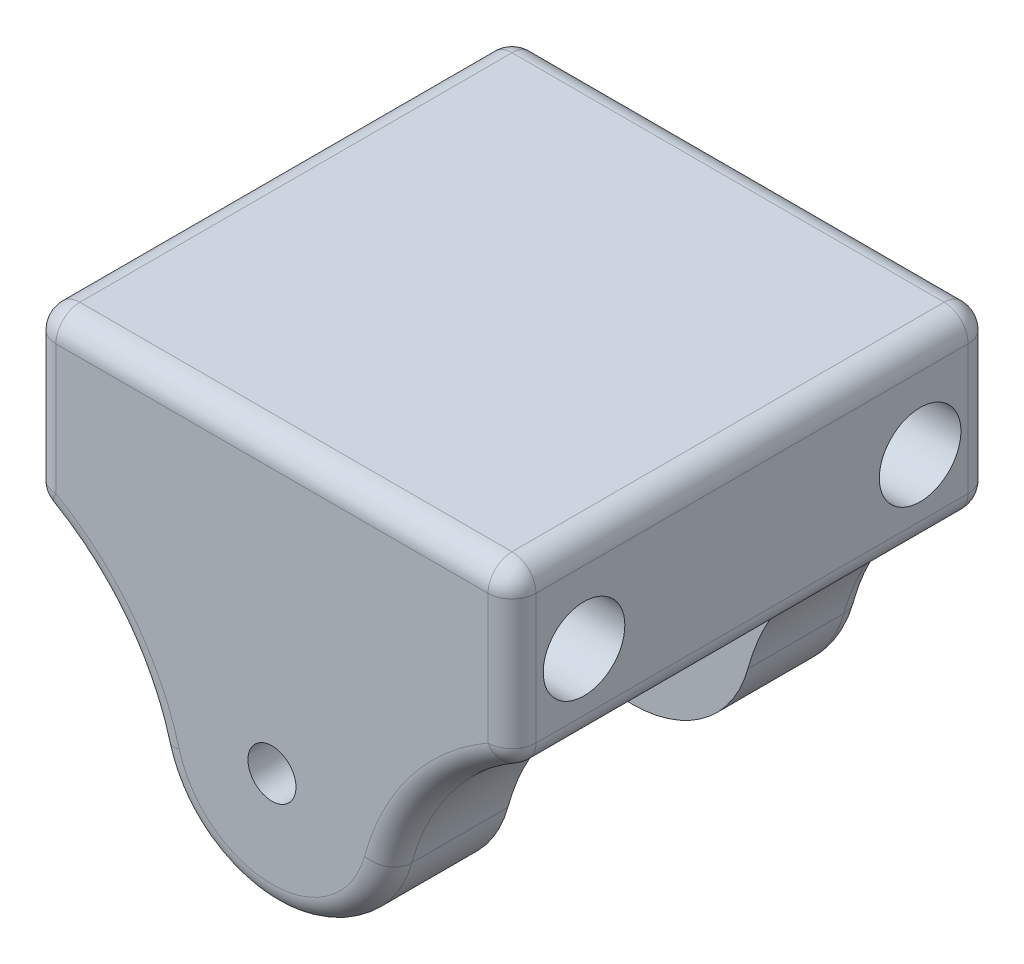
ISO-10303-21;
HEADER;
FILE_DESCRIPTION(('STEP AP214'),'2;1');
FILE_NAME('part.step','',(''),(''),'','','');
FILE_SCHEMA(('AUTOMOTIVE_DESIGN { 1 0 10303 214 1 1 1 1 }'));
ENDSEC;
DATA;
#1=APPLICATION_CONTEXT('core data for automotive mechanical design processes');
#2=APPLICATION_PROTOCOL_DEFINITION('international standard','automotive_design',2000,#1);
#3=PRODUCT_CONTEXT('',#1,'mechanical');
#4=PRODUCT('Part','Part','',(#3));
#5=PRODUCT_RELATED_PRODUCT_CATEGORY('part','',(#4));
#6=PRODUCT_DEFINITION_FORMATION('','',#4);
#7=PRODUCT_DEFINITION_CONTEXT('part definition',#1,'design');
#8=PRODUCT_DEFINITION('design','',#6,#7);
#9=PRODUCT_DEFINITION_SHAPE('','',#8);
#10=(LENGTH_UNIT() NAMED_UNIT(*) SI_UNIT(.MILLI.,.METRE.));
#11=(NAMED_UNIT(*) PLANE_ANGLE_UNIT() SI_UNIT($,.RADIAN.));
#12=(NAMED_UNIT(*) SI_UNIT($,.STERADIAN.) SOLID_ANGLE_UNIT());
#13=UNCERTAINTY_MEASURE_WITH_UNIT(LENGTH_MEASURE(1.E-05),#10,'distance_accuracy_value','');
#14=(GEOMETRIC_REPRESENTATION_CONTEXT(3) GLOBAL_UNCERTAINTY_ASSIGNED_CONTEXT((#13)) GLOBAL_UNIT_ASSIGNED_CONTEXT((#10,
#11,#12)) REPRESENTATION_CONTEXT('',''));
#15=CARTESIAN_POINT('',(0.,0.,0.));
#16=DIRECTION('',(0.,0.,1.));
#17=DIRECTION('',(1.,0.,0.));
#18=AXIS2_PLACEMENT_3D('',#15,#16,#17);
#19=CARTESIAN_POINT('',(0.,0.,20.));
#20=DIRECTION('',(0.,0.,-1.));
#21=DIRECTION('',(-1.,0.,0.));
#22=AXIS2_PLACEMENT_3D('',#19,#20,#21);
#23=CYLINDRICAL_SURFACE('',#22,5.);
#24=DIRECTION('',(0.,0.,-1.));
#25=VECTOR('',#24,1.);
#26=CARTESIAN_POINT('',(4.82404531833319,-1.31475730333305,17.5));
#27=LINE('',#26,#25);
#28=CARTESIAN_POINT('',(4.8240464545791,-1.31475313426621,15.));
#29=VERTEX_POINT('',#28);
#30=CARTESIAN_POINT('',(4.82404531833319,-1.31475730333305,19.));
#31=VERTEX_POINT('',#30);
#32=EDGE_CURVE('E205',#29,#31,#27,.F.);
#33=ORIENTED_EDGE('',*,*,#32,.T.);
#34=CARTESIAN_POINT('',(0.,0.,19.));
#35=DIRECTION('',(0.,0.,1.));
#36=DIRECTION('',(1.,0.,0.));
#37=AXIS2_PLACEMENT_3D('',#34,#35,#36);
#38=CIRCLE('',#37,5.);
#39=CARTESIAN_POINT('',(-4.82404531833319,-1.31475730333306,19.));
#40=VERTEX_POINT('',#39);
#41=EDGE_CURVE('E255',#31,#40,#38,.F.);
#42=ORIENTED_EDGE('',*,*,#41,.T.);
#43=DIRECTION('',(0.,0.,-1.));
#44=VECTOR('',#43,1.);
#45=CARTESIAN_POINT('',(-4.82404531833319,-1.31475730333306,20.));
#46=LINE('',#45,#44);
#47=CARTESIAN_POINT('',(-4.82404531833319,-1.31475730333305,15.));
#48=VERTEX_POINT('',#47);
#49=EDGE_CURVE('E188',#40,#48,#46,.T.);
#50=ORIENTED_EDGE('',*,*,#49,.T.);
#51=CARTESIAN_POINT('',(0.,0.,15.));
#52=DIRECTION('',(0.,0.,1.));
#53=DIRECTION('',(1.,0.,0.));
#54=AXIS2_PLACEMENT_3D('',#51,#52,#53);
#55=CIRCLE('',#54,5.);
#56=EDGE_CURVE('E375',#48,#29,#55,.T.);
#57=ORIENTED_EDGE('',*,*,#56,.T.);
#58=EDGE_LOOP('',(#33,#42,#50,#57));
#59=FACE_BOUND('',#58,.T.);
#60=ADVANCED_FACE('F41',(#59),#23,.T.);
#61=CARTESIAN_POINT('',(0.,0.,20.));
#62=DIRECTION('',(0.,0.,-1.));
#63=DIRECTION('',(-1.,0.,0.));
#64=AXIS2_PLACEMENT_3D('',#61,#62,#63);
#65=CYLINDRICAL_SURFACE('',#64,1.);
#66=CARTESIAN_POINT('',(0.,0.,15.));
#67=DIRECTION('',(0.,0.,1.));
#68=DIRECTION('',(1.,0.,0.));
#69=AXIS2_PLACEMENT_3D('',#66,#67,#68);
#70=CIRCLE('',#69,1.);
#71=CARTESIAN_POINT('',(1.,0.,15.));
#72=VERTEX_POINT('',#71);
#73=EDGE_CURVE('E198',#72,#72,#70,.T.);
#74=ORIENTED_EDGE('',*,*,#73,.F.);
#75=EDGE_LOOP('',(#74));
#76=FACE_BOUND('',#75,.T.);
#77=CARTESIAN_POINT('',(0.,0.,20.));
#78=DIRECTION('',(0.,0.,1.));
#79=DIRECTION('',(1.,0.,0.));
#80=AXIS2_PLACEMENT_3D('',#77,#78,#79);
#81=CIRCLE('',#80,1.);
#82=CARTESIAN_POINT('',(1.,0.,20.));
#83=VERTEX_POINT('',#82);
#84=EDGE_CURVE('E391',#83,#83,#81,.T.);
#85=ORIENTED_EDGE('',*,*,#84,.T.);
#86=EDGE_LOOP('',(#85));
#87=FACE_BOUND('',#86,.T.);
#88=ADVANCED_FACE('F512',(#76,#87),#65,.F.);
#89=CARTESIAN_POINT('',(0.,0.,20.));
#90=DIRECTION('',(0.,0.,1.));
#91=DIRECTION('',(1.,0.,0.));
#92=AXIS2_PLACEMENT_3D('',#89,#90,#91);
#93=PLANE('',#92);
#94=DIRECTION('',(0.,-1.,0.));
#95=VECTOR('',#94,1.);
#96=CARTESIAN_POINT('',(-9.,5.,20.));
#97=LINE('',#96,#95);
#98=CARTESIAN_POINT('',(-9.,11.,20.));
#99=VERTEX_POINT('',#98);
#100=CARTESIAN_POINT('',(-9.,5.59804060269926,20.));
#101=VERTEX_POINT('',#100);
#102=EDGE_CURVE('E244',#99,#101,#97,.T.);
#103=ORIENTED_EDGE('',*,*,#102,.T.);
#104=CARTESIAN_POINT('',(-14.4721359549996,-3.94427190999916,20.));
#105=DIRECTION('',(0.,0.,1.));
#106=DIRECTION('',(1.,0.,0.));
#107=AXIS2_PLACEMENT_3D('',#104,#105,#106);
#108=CIRCLE('',#107,11.);
#109=CARTESIAN_POINT('',(-3.85923625466655,-1.05180584266644,20.));
#110=VERTEX_POINT('',#109);
#111=EDGE_CURVE('E252',#101,#110,#108,.F.);
#112=ORIENTED_EDGE('',*,*,#111,.T.);
#113=CARTESIAN_POINT('',(0.,0.,20.));
#114=DIRECTION('',(0.,0.,1.));
#115=DIRECTION('',(1.,0.,0.));
#116=AXIS2_PLACEMENT_3D('',#113,#114,#115);
#117=CIRCLE('',#116,4.);
#118=CARTESIAN_POINT('',(3.85923625466655,-1.05180584266644,20.));
#119=VERTEX_POINT('',#118);
#120=EDGE_CURVE('E250',#110,#119,#117,.T.);
#121=ORIENTED_EDGE('',*,*,#120,.T.);
#122=CARTESIAN_POINT('',(14.4721359549996,-3.94427190999916,20.));
#123=DIRECTION('',(0.,0.,1.));
#124=DIRECTION('',(1.,0.,0.));
#125=AXIS2_PLACEMENT_3D('',#122,#123,#124);
#126=CIRCLE('',#125,11.);
#127=CARTESIAN_POINT('',(9.,5.59804060269926,20.));
#128=VERTEX_POINT('',#127);
#129=EDGE_CURVE('E248',#119,#128,#126,.F.);
#130=ORIENTED_EDGE('',*,*,#129,.T.);
#131=DIRECTION('',(0.,1.,0.));
#132=VECTOR('',#131,1.);
#133=CARTESIAN_POINT('',(9.,12.,20.));
#134=LINE('',#133,#132);
#135=CARTESIAN_POINT('',(9.,11.,20.));
#136=VERTEX_POINT('',#135);
#137=EDGE_CURVE('E246',#128,#136,#134,.T.);
#138=ORIENTED_EDGE('',*,*,#137,.T.);
#139=DIRECTION('',(1.,0.,0.));
#140=VECTOR('',#139,1.);
#141=CARTESIAN_POINT('',(-10.,11.,20.));
#142=LINE('',#141,#140);
#143=EDGE_CURVE('E242',#136,#99,#142,.F.);
#144=ORIENTED_EDGE('',*,*,#143,.T.);
#145=EDGE_LOOP('',(#103,#112,#121,#130,#138,#144));
#146=FACE_BOUND('',#145,.T.);
#147=ORIENTED_EDGE('',*,*,#84,.F.);
#148=EDGE_LOOP('',(#147));
#149=FACE_BOUND('',#148,.T.);
#150=ADVANCED_FACE('F519',(#146,#149),#93,.T.);
#151=CARTESIAN_POINT('',(0.,0.,0.));
#152=DIRECTION('',(0.,0.,1.));
#153=DIRECTION('',(1.,0.,0.));
#154=AXIS2_PLACEMENT_3D('',#151,#152,#153);
#155=PLANE('',#154);
#156=CARTESIAN_POINT('',(0.,0.,0.));
#157=DIRECTION('',(0.,0.,1.));
#158=DIRECTION('',(1.,0.,0.));
#159=AXIS2_PLACEMENT_3D('',#156,#157,#158);
#160=CIRCLE('',#159,4.);
#161=CARTESIAN_POINT('',(3.85923625466655,-1.05180584266644,0.));
#162=VERTEX_POINT('',#161);
#163=CARTESIAN_POINT('',(-3.85923625466655,-1.05180584266644,0.));
#164=VERTEX_POINT('',#163);
#165=EDGE_CURVE('E229',#162,#164,#160,.F.);
#166=ORIENTED_EDGE('',*,*,#165,.T.);
#167=CARTESIAN_POINT('',(-14.4721359549996,-3.94427190999916,0.));
#168=DIRECTION('',(0.,0.,1.));
#169=DIRECTION('',(1.,0.,0.));
#170=AXIS2_PLACEMENT_3D('',#167,#168,#169);
#171=CIRCLE('',#170,11.);
#172=CARTESIAN_POINT('',(-9.,5.59804060269926,0.));
#173=VERTEX_POINT('',#172);
#174=EDGE_CURVE('E231',#164,#173,#171,.T.);
#175=ORIENTED_EDGE('',*,*,#174,.T.);
#176=DIRECTION('',(0.,-1.,0.));
#177=VECTOR('',#176,1.);
#178=CARTESIAN_POINT('',(-9.,0.,0.));
#179=LINE('',#178,#177);
#180=CARTESIAN_POINT('',(-9.,11.,0.));
#181=VERTEX_POINT('',#180);
#182=EDGE_CURVE('E223',#173,#181,#179,.F.);
#183=ORIENTED_EDGE('',*,*,#182,.T.);
#184=DIRECTION('',(1.,0.,0.));
#185=VECTOR('',#184,1.);
#186=CARTESIAN_POINT('',(0.,11.,0.));
#187=LINE('',#186,#185);
#188=CARTESIAN_POINT('',(9.,11.,0.));
#189=VERTEX_POINT('',#188);
#190=EDGE_CURVE('E221',#181,#189,#187,.T.);
#191=ORIENTED_EDGE('',*,*,#190,.T.);
#192=DIRECTION('',(0.,1.,0.));
#193=VECTOR('',#192,1.);
#194=CARTESIAN_POINT('',(9.,0.,0.));
#195=LINE('',#194,#193);
#196=CARTESIAN_POINT('',(9.,5.59804060269926,0.));
#197=VERTEX_POINT('',#196);
#198=EDGE_CURVE('E225',#189,#197,#195,.F.);
#199=ORIENTED_EDGE('',*,*,#198,.T.);
#200=CARTESIAN_POINT('',(14.4721359549996,-3.94427190999916,0.));
#201=DIRECTION('',(0.,0.,1.));
#202=DIRECTION('',(1.,0.,0.));
#203=AXIS2_PLACEMENT_3D('',#200,#201,#202);
#204=CIRCLE('',#203,11.);
#205=EDGE_CURVE('E227',#197,#162,#204,.T.);
#206=ORIENTED_EDGE('',*,*,#205,.T.);
#207=EDGE_LOOP('',(#166,#175,#183,#191,#199,#206));
#208=FACE_BOUND('',#207,.T.);
#209=CARTESIAN_POINT('',(0.,0.,0.));
#210=DIRECTION('',(0.,0.,1.));
#211=DIRECTION('',(1.,0.,0.));
#212=AXIS2_PLACEMENT_3D('',#209,#210,#211);
#213=CIRCLE('',#212,1.);
#214=CARTESIAN_POINT('',(1.,0.,0.));
#215=VERTEX_POINT('',#214);
#216=EDGE_CURVE('E382',#215,#215,#213,.T.);
#217=ORIENTED_EDGE('',*,*,#216,.T.);
#218=EDGE_LOOP('',(#217));
#219=FACE_BOUND('',#218,.T.);
#220=ADVANCED_FACE('F448',(#208,#219),#155,.F.);
#221=DIRECTION('',(0.,0.,-1.));
#222=VECTOR('',#221,1.);
#223=CARTESIAN_POINT('',(-4.82404531833319,-1.31475730333305,2.5));
#224=LINE('',#223,#222);
#225=CARTESIAN_POINT('',(-4.82404645482702,-1.31475313335655,5.));
#226=VERTEX_POINT('',#225);
#227=CARTESIAN_POINT('',(-4.82404531833319,-1.31475730333305,1.));
#228=VERTEX_POINT('',#227);
#229=EDGE_CURVE('E189',#226,#228,#224,.T.);
#230=ORIENTED_EDGE('',*,*,#229,.T.);
#231=CARTESIAN_POINT('',(0.,0.,1.));
#232=DIRECTION('',(0.,0.,1.));
#233=DIRECTION('',(1.,0.,0.));
#234=AXIS2_PLACEMENT_3D('',#231,#232,#233);
#235=CIRCLE('',#234,5.);
#236=CARTESIAN_POINT('',(4.82404531833319,-1.31475730333305,1.));
#237=VERTEX_POINT('',#236);
#238=EDGE_CURVE('E184',#228,#237,#235,.T.);
#239=ORIENTED_EDGE('',*,*,#238,.T.);
#240=DIRECTION('',(0.,0.,-1.));
#241=VECTOR('',#240,1.);
#242=CARTESIAN_POINT('',(4.82404531833319,-1.31475730333305,20.));
#243=LINE('',#242,#241);
#244=CARTESIAN_POINT('',(4.82404531833319,-1.31475730333305,5.));
#245=VERTEX_POINT('',#244);
#246=EDGE_CURVE('E177',#237,#245,#243,.F.);
#247=ORIENTED_EDGE('',*,*,#246,.T.);
#248=CARTESIAN_POINT('',(0.,0.,5.));
#249=DIRECTION('',(0.,0.,-1.));
#250=DIRECTION('',(-1.,0.,0.));
#251=AXIS2_PLACEMENT_3D('',#248,#249,#250);
#252=CIRCLE('',#251,5.);
#253=EDGE_CURVE('E181',#245,#226,#252,.T.);
#254=ORIENTED_EDGE('',*,*,#253,.T.);
#255=EDGE_LOOP('',(#230,#239,#247,#254));
#256=FACE_BOUND('',#255,.T.);
#257=ADVANCED_FACE('F180',(#256),#23,.T.);
#258=CARTESIAN_POINT('',(10.,5.,20.));
#259=DIRECTION('',(-1.,0.,0.));
#260=DIRECTION('',(0.,0.,1.));
#261=AXIS2_PLACEMENT_3D('',#258,#259,#260);
#262=PLANE('',#261);
#263=DIRECTION('',(0.,1.,0.));
#264=VECTOR('',#263,1.);
#265=CARTESIAN_POINT('',(10.,5.,1.));
#266=LINE('',#265,#264);
#267=CARTESIAN_POINT('',(10.,5.59804060269926,1.));
#268=VERTEX_POINT('',#267);
#269=CARTESIAN_POINT('',(10.,11.,1.));
#270=VERTEX_POINT('',#269);
#271=EDGE_CURVE('E265',#268,#270,#266,.T.);
#272=ORIENTED_EDGE('',*,*,#271,.T.);
#273=DIRECTION('',(0.,0.,-1.));
#274=VECTOR('',#273,1.);
#275=CARTESIAN_POINT('',(10.,11.,20.));
#276=LINE('',#275,#274);
#277=CARTESIAN_POINT('',(10.,11.,19.));
#278=VERTEX_POINT('',#277);
#279=EDGE_CURVE('E270',#270,#278,#276,.F.);
#280=ORIENTED_EDGE('',*,*,#279,.T.);
#281=DIRECTION('',(0.,1.,0.));
#282=VECTOR('',#281,1.);
#283=CARTESIAN_POINT('',(10.,5.,19.));
#284=LINE('',#283,#282);
#285=CARTESIAN_POINT('',(10.,5.59804060269926,19.));
#286=VERTEX_POINT('',#285);
#287=EDGE_CURVE('E267',#278,#286,#284,.F.);
#288=ORIENTED_EDGE('',*,*,#287,.T.);
#289=DIRECTION('',(0.,0.,1.));
#290=VECTOR('',#289,1.);
#291=CARTESIAN_POINT('',(10.,5.59804060269926,20.));
#292=LINE('',#291,#290);
#293=EDGE_CURVE('E263',#286,#268,#292,.F.);
#294=ORIENTED_EDGE('',*,*,#293,.T.);
#295=EDGE_LOOP('',(#272,#280,#288,#294));
#296=FACE_BOUND('',#295,.T.);
#297=CARTESIAN_POINT('',(10.,8.,17.));
#298=DIRECTION('',(1.,0.,0.));
#299=DIRECTION('',(0.,0.,-1.));
#300=AXIS2_PLACEMENT_3D('',#297,#298,#299);
#301=CIRCLE('',#300,1.7);
#302=CARTESIAN_POINT('',(10.,8.,15.3));
#303=VERTEX_POINT('',#302);
#304=EDGE_CURVE('E383',#303,#303,#301,.T.);
#305=ORIENTED_EDGE('',*,*,#304,.F.);
#306=EDGE_LOOP('',(#305));
#307=FACE_BOUND('',#306,.T.);
#308=CARTESIAN_POINT('',(10.,8.,3.));
#309=DIRECTION('',(1.,0.,0.));
#310=DIRECTION('',(0.,0.,1.));
#311=AXIS2_PLACEMENT_3D('',#308,#309,#310);
#312=CIRCLE('',#311,1.7);
#313=CARTESIAN_POINT('',(10.,8.,4.7));
#314=VERTEX_POINT('',#313);
#315=EDGE_CURVE('E386',#314,#314,#312,.T.);
#316=ORIENTED_EDGE('',*,*,#315,.F.);
#317=EDGE_LOOP('',(#316));
#318=FACE_BOUND('',#317,.T.);
#319=ADVANCED_FACE('F472',(#296,#307,#318),#262,.F.);
#320=CARTESIAN_POINT('',(-10.,5.,20.));
#321=DIRECTION('',(1.,0.,0.));
#322=DIRECTION('',(0.,0.,-1.));
#323=AXIS2_PLACEMENT_3D('',#320,#321,#322);
#324=PLANE('',#323);
#325=DIRECTION('',(0.,-1.,0.));
#326=VECTOR('',#325,1.);
#327=CARTESIAN_POINT('',(-10.,5.,1.));
#328=LINE('',#327,#326);
#329=CARTESIAN_POINT('',(-10.,11.,1.));
#330=VERTEX_POINT('',#329);
#331=CARTESIAN_POINT('',(-10.,5.59804060269926,1.));
#332=VERTEX_POINT('',#331);
#333=EDGE_CURVE('E276',#330,#332,#328,.T.);
#334=ORIENTED_EDGE('',*,*,#333,.T.);
#335=DIRECTION('',(0.,0.,1.));
#336=VECTOR('',#335,1.);
#337=CARTESIAN_POINT('',(-10.,5.59804060269926,20.));
#338=LINE('',#337,#336);
#339=CARTESIAN_POINT('',(-10.,5.59804060269926,19.));
#340=VERTEX_POINT('',#339);
#341=EDGE_CURVE('E279',#332,#340,#338,.T.);
#342=ORIENTED_EDGE('',*,*,#341,.T.);
#343=DIRECTION('',(0.,-1.,0.));
#344=VECTOR('',#343,1.);
#345=CARTESIAN_POINT('',(-10.,12.,19.));
#346=LINE('',#345,#344);
#347=CARTESIAN_POINT('',(-10.,11.,19.));
#348=VERTEX_POINT('',#347);
#349=EDGE_CURVE('E274',#340,#348,#346,.F.);
#350=ORIENTED_EDGE('',*,*,#349,.T.);
#351=DIRECTION('',(0.,0.,-1.));
#352=VECTOR('',#351,1.);
#353=CARTESIAN_POINT('',(-10.,11.,20.));
#354=LINE('',#353,#352);
#355=EDGE_CURVE('E272',#348,#330,#354,.T.);
#356=ORIENTED_EDGE('',*,*,#355,.T.);
#357=EDGE_LOOP('',(#334,#342,#350,#356));
#358=FACE_BOUND('',#357,.T.);
#359=CARTESIAN_POINT('',(-10.,8.,17.));
#360=DIRECTION('',(1.,0.,0.));
#361=DIRECTION('',(0.,0.,-1.));
#362=AXIS2_PLACEMENT_3D('',#359,#360,#361);
#363=CIRCLE('',#362,1.7);
#364=CARTESIAN_POINT('',(-10.,8.,15.3));
#365=VERTEX_POINT('',#364);
#366=EDGE_CURVE('E379',#365,#365,#363,.T.);
#367=ORIENTED_EDGE('',*,*,#366,.T.);
#368=EDGE_LOOP('',(#367));
#369=FACE_BOUND('',#368,.T.);
#370=CARTESIAN_POINT('',(-10.,8.,3.));
#371=DIRECTION('',(1.,0.,0.));
#372=DIRECTION('',(0.,0.,1.));
#373=AXIS2_PLACEMENT_3D('',#370,#371,#372);
#374=CIRCLE('',#373,1.7);
#375=CARTESIAN_POINT('',(-10.,8.,4.7));
#376=VERTEX_POINT('',#375);
#377=EDGE_CURVE('E378',#376,#376,#374,.T.);
#378=ORIENTED_EDGE('',*,*,#377,.T.);
#379=EDGE_LOOP('',(#378));
#380=FACE_BOUND('',#379,.T.);
#381=ADVANCED_FACE('F530',(#358,#369,#380),#324,.F.);
#382=CARTESIAN_POINT('',(0.,0.,5.));
#383=DIRECTION('',(0.,0.,-1.));
#384=DIRECTION('',(-1.,0.,0.));
#385=AXIS2_PLACEMENT_3D('',#382,#383,#384);
#386=CIRCLE('',#385,1.);
#387=CARTESIAN_POINT('',(-1.,0.,5.));
#388=VERTEX_POINT('',#387);
#389=EDGE_CURVE('E199',#388,#388,#386,.T.);
#390=ORIENTED_EDGE('',*,*,#389,.F.);
#391=EDGE_LOOP('',(#390));
#392=FACE_BOUND('',#391,.T.);
#393=ORIENTED_EDGE('',*,*,#216,.F.);
#394=EDGE_LOOP('',(#393));
#395=FACE_BOUND('',#394,.T.);
#396=ADVANCED_FACE('F522',(#392,#395),#65,.F.);
#397=CARTESIAN_POINT('',(-10.,8.,3.));
#398=DIRECTION('',(1.,0.,0.));
#399=DIRECTION('',(0.,0.,-1.));
#400=AXIS2_PLACEMENT_3D('',#397,#398,#399);
#401=CYLINDRICAL_SURFACE('',#400,1.7);
#402=ORIENTED_EDGE('',*,*,#377,.F.);
#403=EDGE_LOOP('',(#402));
#404=FACE_BOUND('',#403,.T.);
#405=ORIENTED_EDGE('',*,*,#315,.T.);
#406=EDGE_LOOP('',(#405));
#407=FACE_BOUND('',#406,.T.);
#408=ADVANCED_FACE('F543',(#404,#407),#401,.F.);
#409=CARTESIAN_POINT('',(-10.,8.,17.));
#410=DIRECTION('',(1.,0.,0.));
#411=DIRECTION('',(0.,0.,-1.));
#412=AXIS2_PLACEMENT_3D('',#409,#410,#411);
#413=CYLINDRICAL_SURFACE('',#412,1.7);
#414=ORIENTED_EDGE('',*,*,#366,.F.);
#415=EDGE_LOOP('',(#414));
#416=FACE_BOUND('',#415,.T.);
#417=ORIENTED_EDGE('',*,*,#304,.T.);
#418=EDGE_LOOP('',(#417));
#419=FACE_BOUND('',#418,.T.);
#420=ADVANCED_FACE('F552',(#416,#419),#413,.F.);
#421=CARTESIAN_POINT('',(-10.,12.,20.));
#422=DIRECTION('',(0.,-1.,0.));
#423=DIRECTION('',(0.,0.,-1.));
#424=AXIS2_PLACEMENT_3D('',#421,#422,#423);
#425=PLANE('',#424);
#426=DIRECTION('',(1.,0.,0.));
#427=VECTOR('',#426,1.);
#428=CARTESIAN_POINT('',(-10.,12.,1.));
#429=LINE('',#428,#427);
#430=CARTESIAN_POINT('',(9.,12.,1.));
#431=VERTEX_POINT('',#430);
#432=CARTESIAN_POINT('',(-9.,12.,1.));
#433=VERTEX_POINT('',#432);
#434=EDGE_CURVE('E61',#431,#433,#429,.F.);
#435=ORIENTED_EDGE('',*,*,#434,.T.);
#436=DIRECTION('',(0.,0.,-1.));
#437=VECTOR('',#436,1.);
#438=CARTESIAN_POINT('',(-9.,12.,20.));
#439=LINE('',#438,#437);
#440=CARTESIAN_POINT('',(-9.,12.,19.));
#441=VERTEX_POINT('',#440);
#442=EDGE_CURVE('E11',#433,#441,#439,.F.);
#443=ORIENTED_EDGE('',*,*,#442,.T.);
#444=DIRECTION('',(1.,0.,0.));
#445=VECTOR('',#444,1.);
#446=CARTESIAN_POINT('',(10.,12.,19.));
#447=LINE('',#446,#445);
#448=CARTESIAN_POINT('',(9.,12.,19.));
#449=VERTEX_POINT('',#448);
#450=EDGE_CURVE('E50',#441,#449,#447,.T.);
#451=ORIENTED_EDGE('',*,*,#450,.T.);
#452=DIRECTION('',(0.,0.,-1.));
#453=VECTOR('',#452,1.);
#454=CARTESIAN_POINT('',(9.,12.,20.));
#455=LINE('',#454,#453);
#456=EDGE_CURVE('E281',#449,#431,#455,.T.);
#457=ORIENTED_EDGE('',*,*,#456,.T.);
#458=EDGE_LOOP('',(#435,#443,#451,#457));
#459=FACE_BOUND('',#458,.T.);
#460=ADVANCED_FACE('F497',(#459),#425,.F.);
#461=CARTESIAN_POINT('',(-10.,2.,15.));
#462=DIRECTION('',(0.,1.,0.));
#463=DIRECTION('',(0.,0.,1.));
#464=AXIS2_PLACEMENT_3D('',#461,#462,#463);
#465=PLANE('',#464);
#466=DIRECTION('',(1.,0.,0.));
#467=VECTOR('',#466,1.);
#468=CARTESIAN_POINT('',(-10.,2.,5.));
#469=LINE('',#468,#467);
#470=CARTESIAN_POINT('',(-6.43064160009297,2.,5.));
#471=VERTEX_POINT('',#470);
#472=CARTESIAN_POINT('',(6.43064160009296,2.,5.));
#473=VERTEX_POINT('',#472);
#474=EDGE_CURVE('E365',#471,#473,#469,.T.);
#475=ORIENTED_EDGE('',*,*,#474,.T.);
#476=DIRECTION('',(0.,0.,1.));
#477=VECTOR('',#476,1.);
#478=CARTESIAN_POINT('',(6.43064160009296,2.,5.));
#479=LINE('',#478,#477);
#480=CARTESIAN_POINT('',(6.43064160009296,2.,15.));
#481=VERTEX_POINT('',#480);
#482=EDGE_CURVE('E204',#473,#481,#479,.T.);
#483=ORIENTED_EDGE('',*,*,#482,.T.);
#484=DIRECTION('',(1.,0.,0.));
#485=VECTOR('',#484,1.);
#486=CARTESIAN_POINT('',(-10.,2.,15.));
#487=LINE('',#486,#485);
#488=CARTESIAN_POINT('',(-6.43064160009297,2.,15.));
#489=VERTEX_POINT('',#488);
#490=EDGE_CURVE('E370',#489,#481,#487,.T.);
#491=ORIENTED_EDGE('',*,*,#490,.F.);
#492=DIRECTION('',(0.,0.,1.));
#493=VECTOR('',#492,1.);
#494=CARTESIAN_POINT('',(-6.43064160009297,2.,15.));
#495=LINE('',#494,#493);
#496=EDGE_CURVE('E217',#489,#471,#495,.F.);
#497=ORIENTED_EDGE('',*,*,#496,.T.);
#498=EDGE_LOOP('',(#475,#483,#491,#497));
#499=FACE_BOUND('',#498,.T.);
#500=ADVANCED_FACE('F563',(#499),#465,.F.);
#501=CARTESIAN_POINT('',(-10.,-5.,15.));
#502=DIRECTION('',(0.,0.,1.));
#503=DIRECTION('',(1.,0.,0.));
#504=AXIS2_PLACEMENT_3D('',#501,#502,#503);
#505=PLANE('',#504);
#506=ORIENTED_EDGE('',*,*,#73,.T.);
#507=EDGE_LOOP('',(#506));
#508=FACE_BOUND('',#507,.T.);
#509=ORIENTED_EDGE('',*,*,#56,.F.);
#510=CARTESIAN_POINT('',(-14.4721359549996,-3.94427190999916,15.));
#511=DIRECTION('',(0.,0.,1.));
#512=DIRECTION('',(1.,0.,0.));
#513=AXIS2_PLACEMENT_3D('',#510,#511,#512);
#514=CIRCLE('',#513,10.);
#515=EDGE_CURVE('E214',#48,#489,#514,.T.);
#516=ORIENTED_EDGE('',*,*,#515,.T.);
#517=ORIENTED_EDGE('',*,*,#490,.T.);
#518=CARTESIAN_POINT('',(14.4721359549996,-3.94427190999916,15.));
#519=DIRECTION('',(0.,0.,1.));
#520=DIRECTION('',(1.,0.,0.));
#521=AXIS2_PLACEMENT_3D('',#518,#519,#520);
#522=CIRCLE('',#521,10.);
#523=EDGE_CURVE('E207',#481,#29,#522,.T.);
#524=ORIENTED_EDGE('',*,*,#523,.T.);
#525=EDGE_LOOP('',(#509,#516,#517,#524));
#526=FACE_BOUND('',#525,.T.);
#527=ADVANCED_FACE('F411',(#508,#526),#505,.F.);
#528=CARTESIAN_POINT('',(-10.,2.,5.));
#529=DIRECTION('',(0.,0.,-1.));
#530=DIRECTION('',(-1.,0.,0.));
#531=AXIS2_PLACEMENT_3D('',#528,#529,#530);
#532=PLANE('',#531);
#533=ORIENTED_EDGE('',*,*,#389,.T.);
#534=EDGE_LOOP('',(#533));
#535=FACE_BOUND('',#534,.T.);
#536=ORIENTED_EDGE('',*,*,#253,.F.);
#537=CARTESIAN_POINT('',(14.4721359549996,-3.94427190999916,5.));
#538=DIRECTION('',(0.,0.,-1.));
#539=DIRECTION('',(-1.,0.,0.));
#540=AXIS2_PLACEMENT_3D('',#537,#538,#539);
#541=CIRCLE('',#540,10.);
#542=EDGE_CURVE('E194',#245,#473,#541,.T.);
#543=ORIENTED_EDGE('',*,*,#542,.T.);
#544=ORIENTED_EDGE('',*,*,#474,.F.);
#545=CARTESIAN_POINT('',(-14.4721359549996,-3.94427190999916,5.));
#546=DIRECTION('',(0.,0.,-1.));
#547=DIRECTION('',(-1.,0.,0.));
#548=AXIS2_PLACEMENT_3D('',#545,#546,#547);
#549=CIRCLE('',#548,10.);
#550=EDGE_CURVE('E197',#471,#226,#549,.T.);
#551=ORIENTED_EDGE('',*,*,#550,.T.);
#552=EDGE_LOOP('',(#536,#543,#544,#551));
#553=FACE_BOUND('',#552,.T.);
#554=ADVANCED_FACE('F193',(#535,#553),#532,.F.);
#555=CARTESIAN_POINT('',(14.4721359549996,-3.94427190999916,20.));
#556=DIRECTION('',(0.,0.,1.));
#557=DIRECTION('',(1.,0.,0.));
#558=AXIS2_PLACEMENT_3D('',#555,#556,#557);
#559=CYLINDRICAL_SURFACE('',#558,10.);
#560=ORIENTED_EDGE('',*,*,#246,.F.);
#561=CARTESIAN_POINT('',(14.4721359549996,-3.94427190999916,1.));
#562=DIRECTION('',(0.,0.,1.));
#563=DIRECTION('',(1.,0.,0.));
#564=AXIS2_PLACEMENT_3D('',#561,#562,#563);
#565=CIRCLE('',#564,10.);
#566=CARTESIAN_POINT('',(9.49746690499996,4.73055764699941,1.));
#567=VERTEX_POINT('',#566);
#568=EDGE_CURVE('E261',#237,#567,#565,.F.);
#569=ORIENTED_EDGE('',*,*,#568,.T.);
#570=DIRECTION('',(0.,0.,1.));
#571=VECTOR('',#570,1.);
#572=CARTESIAN_POINT('',(9.49746690499996,4.73055764699941,20.));
#573=LINE('',#572,#571);
#574=CARTESIAN_POINT('',(9.49746690499996,4.73055764699941,19.));
#575=VERTEX_POINT('',#574);
#576=EDGE_CURVE('E257',#567,#575,#573,.T.);
#577=ORIENTED_EDGE('',*,*,#576,.T.);
#578=CARTESIAN_POINT('',(14.4721359549996,-3.94427190999916,19.));
#579=DIRECTION('',(0.,0.,1.));
#580=DIRECTION('',(1.,0.,0.));
#581=AXIS2_PLACEMENT_3D('',#578,#579,#580);
#582=CIRCLE('',#581,10.);
#583=EDGE_CURVE('E259',#575,#31,#582,.T.);
#584=ORIENTED_EDGE('',*,*,#583,.T.);
#585=ORIENTED_EDGE('',*,*,#32,.F.);
#586=ORIENTED_EDGE('',*,*,#523,.F.);
#587=ORIENTED_EDGE('',*,*,#482,.F.);
#588=ORIENTED_EDGE('',*,*,#542,.F.);
#589=EDGE_LOOP('',(#560,#569,#577,#584,#585,#586,#587,#588));
#590=FACE_BOUND('',#589,.T.);
#591=ADVANCED_FACE('F201',(#590),#559,.F.);
#592=CARTESIAN_POINT('',(-14.4721359549996,-3.94427190999916,20.));
#593=DIRECTION('',(0.,0.,1.));
#594=DIRECTION('',(1.,0.,0.));
#595=AXIS2_PLACEMENT_3D('',#592,#593,#594);
#596=CYLINDRICAL_SURFACE('',#595,10.);
#597=DIRECTION('',(0.,0.,1.));
#598=VECTOR('',#597,1.);
#599=CARTESIAN_POINT('',(-9.49746690499996,4.7305576469994,20.));
#600=LINE('',#599,#598);
#601=CARTESIAN_POINT('',(-9.49746690499996,4.7305576469994,19.));
#602=VERTEX_POINT('',#601);
#603=CARTESIAN_POINT('',(-9.49746690499996,4.7305576469994,1.));
#604=VERTEX_POINT('',#603);
#605=EDGE_CURVE('E234',#602,#604,#600,.F.);
#606=ORIENTED_EDGE('',*,*,#605,.T.);
#607=CARTESIAN_POINT('',(-14.4721359549996,-3.94427190999916,1.));
#608=DIRECTION('',(0.,0.,1.));
#609=DIRECTION('',(1.,0.,0.));
#610=AXIS2_PLACEMENT_3D('',#607,#608,#609);
#611=CIRCLE('',#610,10.);
#612=EDGE_CURVE('E238',#604,#228,#611,.F.);
#613=ORIENTED_EDGE('',*,*,#612,.T.);
#614=ORIENTED_EDGE('',*,*,#229,.F.);
#615=ORIENTED_EDGE('',*,*,#550,.F.);
#616=ORIENTED_EDGE('',*,*,#496,.F.);
#617=ORIENTED_EDGE('',*,*,#515,.F.);
#618=ORIENTED_EDGE('',*,*,#49,.F.);
#619=CARTESIAN_POINT('',(-14.4721359549996,-3.94427190999916,19.));
#620=DIRECTION('',(0.,0.,1.));
#621=DIRECTION('',(1.,0.,0.));
#622=AXIS2_PLACEMENT_3D('',#619,#620,#621);
#623=CIRCLE('',#622,10.);
#624=EDGE_CURVE('E236',#40,#602,#623,.T.);
#625=ORIENTED_EDGE('',*,*,#624,.T.);
#626=EDGE_LOOP('',(#606,#613,#614,#615,#616,#617,#618,#625));
#627=FACE_BOUND('',#626,.T.);
#628=ADVANCED_FACE('F409',(#627),#596,.F.);
#629=CARTESIAN_POINT('',(9.,11.,19.));
#630=DIRECTION('',(1.,0.,0.));
#631=DIRECTION('',(0.,0.,-1.));
#632=AXIS2_PLACEMENT_3D('',#629,#630,#631);
#633=SPHERICAL_SURFACE('',#632,1.);
#634=CARTESIAN_POINT('',(9.,11.,19.));
#635=DIRECTION('',(1.,0.,0.));
#636=DIRECTION('',(0.,0.,-1.));
#637=AXIS2_PLACEMENT_3D('',#634,#635,#636);
#638=CIRCLE('',#637,1.);
#639=EDGE_CURVE('E356',#136,#449,#638,.F.);
#640=ORIENTED_EDGE('',*,*,#639,.F.);
#641=CARTESIAN_POINT('',(9.,11.,19.));
#642=DIRECTION('',(0.,1.,0.));
#643=DIRECTION('',(0.,0.,1.));
#644=AXIS2_PLACEMENT_3D('',#641,#642,#643);
#645=CIRCLE('',#644,1.);
#646=EDGE_CURVE('E45',#278,#136,#645,.F.);
#647=ORIENTED_EDGE('',*,*,#646,.F.);
#648=CARTESIAN_POINT('',(9.,11.,19.));
#649=DIRECTION('',(0.,0.,1.));
#650=DIRECTION('',(1.,0.,0.));
#651=AXIS2_PLACEMENT_3D('',#648,#649,#650);
#652=CIRCLE('',#651,1.);
#653=EDGE_CURVE('E358',#449,#278,#652,.F.);
#654=ORIENTED_EDGE('',*,*,#653,.F.);
#655=EDGE_LOOP('',(#640,#647,#654));
#656=FACE_BOUND('',#655,.T.);
#657=ADVANCED_FACE('F43',(#656),#633,.T.);
#658=CARTESIAN_POINT('',(9.,0.,19.));
#659=DIRECTION('',(0.,-1.,0.));
#660=DIRECTION('',(0.,0.,-1.));
#661=AXIS2_PLACEMENT_3D('',#658,#659,#660);
#662=CYLINDRICAL_SURFACE('',#661,1.);
#663=ORIENTED_EDGE('',*,*,#646,.T.);
#664=ORIENTED_EDGE('',*,*,#137,.F.);
#665=CARTESIAN_POINT('',(9.,5.59804060269926,19.));
#666=DIRECTION('',(0.,-1.,0.));
#667=DIRECTION('',(0.,0.,-1.));
#668=AXIS2_PLACEMENT_3D('',#665,#666,#667);
#669=CIRCLE('',#668,1.);
#670=EDGE_CURVE('E350',#286,#128,#669,.T.);
#671=ORIENTED_EDGE('',*,*,#670,.F.);
#672=ORIENTED_EDGE('',*,*,#287,.F.);
#673=EDGE_LOOP('',(#663,#664,#671,#672));
#674=FACE_BOUND('',#673,.T.);
#675=ADVANCED_FACE('F500',(#674),#662,.T.);
#676=CARTESIAN_POINT('',(9.,11.,20.));
#677=DIRECTION('',(0.,0.,-1.));
#678=DIRECTION('',(-1.,0.,0.));
#679=AXIS2_PLACEMENT_3D('',#676,#677,#678);
#680=CYLINDRICAL_SURFACE('',#679,1.);
#681=ORIENTED_EDGE('',*,*,#653,.T.);
#682=ORIENTED_EDGE('',*,*,#279,.F.);
#683=CARTESIAN_POINT('',(9.,11.,1.));
#684=DIRECTION('',(0.,0.,-1.));
#685=DIRECTION('',(-1.,0.,0.));
#686=AXIS2_PLACEMENT_3D('',#683,#684,#685);
#687=CIRCLE('',#686,1.);
#688=EDGE_CURVE('E347',#431,#270,#687,.T.);
#689=ORIENTED_EDGE('',*,*,#688,.F.);
#690=ORIENTED_EDGE('',*,*,#456,.F.);
#691=EDGE_LOOP('',(#681,#682,#689,#690));
#692=FACE_BOUND('',#691,.T.);
#693=ADVANCED_FACE('F475',(#692),#680,.T.);
#694=CARTESIAN_POINT('',(-10.,11.,19.));
#695=DIRECTION('',(-1.,0.,0.));
#696=DIRECTION('',(0.,0.,1.));
#697=AXIS2_PLACEMENT_3D('',#694,#695,#696);
#698=CYLINDRICAL_SURFACE('',#697,1.);
#699=ORIENTED_EDGE('',*,*,#639,.T.);
#700=ORIENTED_EDGE('',*,*,#450,.F.);
#701=CARTESIAN_POINT('',(-9.,11.,19.));
#702=DIRECTION('',(-1.,0.,0.));
#703=DIRECTION('',(0.,0.,1.));
#704=AXIS2_PLACEMENT_3D('',#701,#702,#703);
#705=CIRCLE('',#704,1.);
#706=EDGE_CURVE('E344',#99,#441,#705,.T.);
#707=ORIENTED_EDGE('',*,*,#706,.F.);
#708=ORIENTED_EDGE('',*,*,#143,.F.);
#709=EDGE_LOOP('',(#699,#700,#707,#708));
#710=FACE_BOUND('',#709,.T.);
#711=ADVANCED_FACE('F496',(#710),#698,.T.);
#712=CARTESIAN_POINT('',(14.4721359549996,-3.94427190999916,19.));
#713=DIRECTION('',(0.,0.,1.));
#714=DIRECTION('',(1.,0.,0.));
#715=AXIS2_PLACEMENT_3D('',#712,#713,#714);
#716=TOROIDAL_SURFACE('',#715,11.,1.);
#717=CARTESIAN_POINT('',(9.,5.59804060269926,19.));
#718=DIRECTION('',(0.867482955699856,0.497466904999962,0.));
#719=DIRECTION('',(-0.497466904999962,0.867482955699856,0.));
#720=AXIS2_PLACEMENT_3D('',#717,#718,#719);
#721=CIRCLE('',#720,1.);
#722=EDGE_CURVE('E353',#128,#575,#721,.T.);
#723=ORIENTED_EDGE('',*,*,#722,.F.);
#724=ORIENTED_EDGE('',*,*,#129,.F.);
#725=CARTESIAN_POINT('',(3.85923625466655,-1.05180584266644,19.));
#726=DIRECTION('',(-0.262951460666611,-0.964809063666639,0.));
#727=DIRECTION('',(0.964809063666639,-0.262951460666611,0.));
#728=AXIS2_PLACEMENT_3D('',#725,#726,#727);
#729=CIRCLE('',#728,1.);
#730=EDGE_CURVE('E341',#31,#119,#729,.T.);
#731=ORIENTED_EDGE('',*,*,#730,.F.);
#732=ORIENTED_EDGE('',*,*,#583,.F.);
#733=EDGE_LOOP('',(#723,#724,#731,#732));
#734=FACE_BOUND('',#733,.T.);
#735=ADVANCED_FACE('F417',(#734),#716,.T.);
#736=CARTESIAN_POINT('',(9.,5.59804060269926,19.));
#737=DIRECTION('',(0.,0.,1.));
#738=DIRECTION('',(0.,-1.,0.));
#739=AXIS2_PLACEMENT_3D('',#736,#737,#738);
#740=SPHERICAL_SURFACE('',#739,1.);
#741=ORIENTED_EDGE('',*,*,#670,.T.);
#742=ORIENTED_EDGE('',*,*,#722,.T.);
#743=CARTESIAN_POINT('',(9.,5.59804060269926,19.));
#744=DIRECTION('',(0.,0.,1.));
#745=DIRECTION('',(1.,0.,0.));
#746=AXIS2_PLACEMENT_3D('',#743,#744,#745);
#747=CIRCLE('',#746,1.);
#748=EDGE_CURVE('E338',#286,#575,#747,.F.);
#749=ORIENTED_EDGE('',*,*,#748,.F.);
#750=EDGE_LOOP('',(#741,#742,#749));
#751=FACE_BOUND('',#750,.T.);
#752=ADVANCED_FACE('F502',(#751),#740,.T.);
#753=CARTESIAN_POINT('',(9.,11.,1.));
#754=DIRECTION('',(1.,0.,0.));
#755=DIRECTION('',(0.,0.,-1.));
#756=AXIS2_PLACEMENT_3D('',#753,#754,#755);
#757=SPHERICAL_SURFACE('',#756,1.);
#758=CARTESIAN_POINT('',(9.,11.,1.));
#759=DIRECTION('',(1.,0.,0.));
#760=DIRECTION('',(0.,1.,0.));
#761=AXIS2_PLACEMENT_3D('',#758,#759,#760);
#762=CIRCLE('',#761,1.);
#763=EDGE_CURVE('E332',#431,#189,#762,.F.);
#764=ORIENTED_EDGE('',*,*,#763,.F.);
#765=ORIENTED_EDGE('',*,*,#688,.T.);
#766=CARTESIAN_POINT('',(9.,11.,1.));
#767=DIRECTION('',(0.,1.,0.));
#768=DIRECTION('',(0.,0.,1.));
#769=AXIS2_PLACEMENT_3D('',#766,#767,#768);
#770=CIRCLE('',#769,1.);
#771=EDGE_CURVE('E335',#189,#270,#770,.F.);
#772=ORIENTED_EDGE('',*,*,#771,.F.);
#773=EDGE_LOOP('',(#764,#765,#772));
#774=FACE_BOUND('',#773,.T.);
#775=ADVANCED_FACE('F478',(#774),#757,.T.);
#776=CARTESIAN_POINT('',(-9.,11.,19.));
#777=DIRECTION('',(0.,1.,0.));
#778=DIRECTION('',(0.,0.,1.));
#779=AXIS2_PLACEMENT_3D('',#776,#777,#778);
#780=SPHERICAL_SURFACE('',#779,1.);
#781=CARTESIAN_POINT('',(-9.,11.,19.));
#782=DIRECTION('',(0.,1.,0.));
#783=DIRECTION('',(0.,0.,1.));
#784=AXIS2_PLACEMENT_3D('',#781,#782,#783);
#785=CIRCLE('',#784,1.);
#786=EDGE_CURVE('E326',#99,#348,#785,.F.);
#787=ORIENTED_EDGE('',*,*,#786,.F.);
#788=ORIENTED_EDGE('',*,*,#706,.T.);
#789=CARTESIAN_POINT('',(-9.,11.,19.));
#790=DIRECTION('',(0.,0.,1.));
#791=DIRECTION('',(1.,0.,0.));
#792=AXIS2_PLACEMENT_3D('',#789,#790,#791);
#793=CIRCLE('',#792,1.);
#794=EDGE_CURVE('E329',#348,#441,#793,.F.);
#795=ORIENTED_EDGE('',*,*,#794,.F.);
#796=EDGE_LOOP('',(#787,#788,#795));
#797=FACE_BOUND('',#796,.T.);
#798=ADVANCED_FACE('F491',(#797),#780,.T.);
#799=CARTESIAN_POINT('',(0.,0.,19.));
#800=DIRECTION('',(0.,0.,1.));
#801=DIRECTION('',(1.,0.,0.));
#802=AXIS2_PLACEMENT_3D('',#799,#800,#801);
#803=TOROIDAL_SURFACE('',#802,4.,1.);
#804=ORIENTED_EDGE('',*,*,#730,.T.);
#805=ORIENTED_EDGE('',*,*,#120,.F.);
#806=CARTESIAN_POINT('',(-3.85923625466655,-1.05180584266644,19.));
#807=DIRECTION('',(-0.262951460666611,0.964809063666639,0.));
#808=DIRECTION('',(-0.964809063666639,-0.262951460666611,0.));
#809=AXIS2_PLACEMENT_3D('',#806,#807,#808);
#810=CIRCLE('',#809,1.);
#811=EDGE_CURVE('E324',#40,#110,#810,.T.);
#812=ORIENTED_EDGE('',*,*,#811,.F.);
#813=ORIENTED_EDGE('',*,*,#41,.F.);
#814=EDGE_LOOP('',(#804,#805,#812,#813));
#815=FACE_BOUND('',#814,.T.);
#816=ADVANCED_FACE('F420',(#815),#803,.T.);
#817=CARTESIAN_POINT('',(9.,5.59804060269926,20.));
#818=DIRECTION('',(0.,0.,1.));
#819=DIRECTION('',(1.,0.,0.));
#820=AXIS2_PLACEMENT_3D('',#817,#818,#819);
#821=CYLINDRICAL_SURFACE('',#820,1.);
#822=ORIENTED_EDGE('',*,*,#748,.T.);
#823=ORIENTED_EDGE('',*,*,#576,.F.);
#824=CARTESIAN_POINT('',(9.,5.59804060269926,1.));
#825=DIRECTION('',(0.,0.,-1.));
#826=DIRECTION('',(-1.,0.,0.));
#827=AXIS2_PLACEMENT_3D('',#824,#825,#826);
#828=CIRCLE('',#827,1.);
#829=EDGE_CURVE('E321',#268,#567,#828,.T.);
#830=ORIENTED_EDGE('',*,*,#829,.F.);
#831=ORIENTED_EDGE('',*,*,#293,.F.);
#832=EDGE_LOOP('',(#822,#823,#830,#831));
#833=FACE_BOUND('',#832,.T.);
#834=ADVANCED_FACE('F461',(#833),#821,.T.);
#835=CARTESIAN_POINT('',(9.,5.,1.));
#836=DIRECTION('',(0.,1.,0.));
#837=DIRECTION('',(0.,0.,1.));
#838=AXIS2_PLACEMENT_3D('',#835,#836,#837);
#839=CYLINDRICAL_SURFACE('',#838,1.);
#840=ORIENTED_EDGE('',*,*,#771,.T.);
#841=ORIENTED_EDGE('',*,*,#271,.F.);
#842=CARTESIAN_POINT('',(9.,5.59804060269926,1.));
#843=DIRECTION('',(0.,-1.,0.));
#844=DIRECTION('',(0.,0.,-1.));
#845=AXIS2_PLACEMENT_3D('',#842,#843,#844);
#846=CIRCLE('',#845,1.);
#847=EDGE_CURVE('E318',#197,#268,#846,.T.);
#848=ORIENTED_EDGE('',*,*,#847,.F.);
#849=ORIENTED_EDGE('',*,*,#198,.F.);
#850=EDGE_LOOP('',(#840,#841,#848,#849));
#851=FACE_BOUND('',#850,.T.);
#852=ADVANCED_FACE('F469',(#851),#839,.T.);
#853=CARTESIAN_POINT('',(0.,11.,1.));
#854=DIRECTION('',(1.,0.,0.));
#855=DIRECTION('',(0.,0.,-1.));
#856=AXIS2_PLACEMENT_3D('',#853,#854,#855);
#857=CYLINDRICAL_SURFACE('',#856,1.);
#858=ORIENTED_EDGE('',*,*,#763,.T.);
#859=ORIENTED_EDGE('',*,*,#190,.F.);
#860=CARTESIAN_POINT('',(-9.,11.,1.));
#861=DIRECTION('',(-1.,0.,0.));
#862=DIRECTION('',(0.,0.,1.));
#863=AXIS2_PLACEMENT_3D('',#860,#861,#862);
#864=CIRCLE('',#863,1.);
#865=EDGE_CURVE('E315',#433,#181,#864,.T.);
#866=ORIENTED_EDGE('',*,*,#865,.F.);
#867=ORIENTED_EDGE('',*,*,#434,.F.);
#868=EDGE_LOOP('',(#858,#859,#866,#867));
#869=FACE_BOUND('',#868,.T.);
#870=ADVANCED_FACE('F481',(#869),#857,.T.);
#871=CARTESIAN_POINT('',(-9.,11.,20.));
#872=DIRECTION('',(0.,0.,-1.));
#873=DIRECTION('',(-1.,0.,0.));
#874=AXIS2_PLACEMENT_3D('',#871,#872,#873);
#875=CYLINDRICAL_SURFACE('',#874,1.);
#876=ORIENTED_EDGE('',*,*,#794,.T.);
#877=ORIENTED_EDGE('',*,*,#442,.F.);
#878=CARTESIAN_POINT('',(-9.,11.,1.));
#879=DIRECTION('',(0.,0.,-1.));
#880=DIRECTION('',(0.,1.,0.));
#881=AXIS2_PLACEMENT_3D('',#878,#879,#880);
#882=CIRCLE('',#881,1.);
#883=EDGE_CURVE('E312',#330,#433,#882,.T.);
#884=ORIENTED_EDGE('',*,*,#883,.F.);
#885=ORIENTED_EDGE('',*,*,#355,.F.);
#886=EDGE_LOOP('',(#876,#877,#884,#885));
#887=FACE_BOUND('',#886,.T.);
#888=ADVANCED_FACE('F487',(#887),#875,.T.);
#889=CARTESIAN_POINT('',(-9.,0.,19.));
#890=DIRECTION('',(0.,1.,0.));
#891=DIRECTION('',(0.,0.,1.));
#892=AXIS2_PLACEMENT_3D('',#889,#890,#891);
#893=CYLINDRICAL_SURFACE('',#892,1.);
#894=ORIENTED_EDGE('',*,*,#786,.T.);
#895=ORIENTED_EDGE('',*,*,#349,.F.);
#896=CARTESIAN_POINT('',(-9.,5.59804060269926,19.));
#897=DIRECTION('',(0.,-1.,0.));
#898=DIRECTION('',(0.,0.,-1.));
#899=AXIS2_PLACEMENT_3D('',#896,#897,#898);
#900=CIRCLE('',#899,1.);
#901=EDGE_CURVE('E309',#101,#340,#900,.T.);
#902=ORIENTED_EDGE('',*,*,#901,.F.);
#903=ORIENTED_EDGE('',*,*,#102,.F.);
#904=EDGE_LOOP('',(#894,#895,#902,#903));
#905=FACE_BOUND('',#904,.T.);
#906=ADVANCED_FACE('F695',(#905),#893,.T.);
#907=CARTESIAN_POINT('',(-14.4721359549996,-3.94427190999916,19.));
#908=DIRECTION('',(0.,0.,1.));
#909=DIRECTION('',(1.,0.,0.));
#910=AXIS2_PLACEMENT_3D('',#907,#908,#909);
#911=TOROIDAL_SURFACE('',#910,11.,1.);
#912=ORIENTED_EDGE('',*,*,#811,.T.);
#913=ORIENTED_EDGE('',*,*,#111,.F.);
#914=CARTESIAN_POINT('',(-9.,5.59804060269926,19.));
#915=DIRECTION('',(-0.867482955699856,0.497466904999962,0.));
#916=DIRECTION('',(-0.497466904999962,-0.867482955699856,0.));
#917=AXIS2_PLACEMENT_3D('',#914,#915,#916);
#918=CIRCLE('',#917,1.);
#919=EDGE_CURVE('E306',#602,#101,#918,.T.);
#920=ORIENTED_EDGE('',*,*,#919,.F.);
#921=ORIENTED_EDGE('',*,*,#624,.F.);
#922=EDGE_LOOP('',(#912,#913,#920,#921));
#923=FACE_BOUND('',#922,.T.);
#924=ADVANCED_FACE('F425',(#923),#911,.T.);
#925=CARTESIAN_POINT('',(9.,5.59804060269926,1.));
#926=DIRECTION('',(0.,0.,-1.));
#927=DIRECTION('',(0.,1.,0.));
#928=AXIS2_PLACEMENT_3D('',#925,#926,#927);
#929=SPHERICAL_SURFACE('',#928,1.);
#930=ORIENTED_EDGE('',*,*,#847,.T.);
#931=ORIENTED_EDGE('',*,*,#829,.T.);
#932=CARTESIAN_POINT('',(9.,5.59804060269926,1.));
#933=DIRECTION('',(0.867482955699856,0.497466904999962,0.));
#934=DIRECTION('',(-0.497466904999962,0.867482955699856,0.));
#935=AXIS2_PLACEMENT_3D('',#932,#933,#934);
#936=CIRCLE('',#935,1.);
#937=EDGE_CURVE('E303',#197,#567,#936,.F.);
#938=ORIENTED_EDGE('',*,*,#937,.F.);
#939=EDGE_LOOP('',(#930,#931,#938));
#940=FACE_BOUND('',#939,.T.);
#941=ADVANCED_FACE('F464',(#940),#929,.T.);
#942=CARTESIAN_POINT('',(-9.,11.,1.));
#943=DIRECTION('',(0.,1.,0.));
#944=DIRECTION('',(0.,0.,1.));
#945=AXIS2_PLACEMENT_3D('',#942,#943,#944);
#946=SPHERICAL_SURFACE('',#945,1.);
#947=ORIENTED_EDGE('',*,*,#883,.T.);
#948=ORIENTED_EDGE('',*,*,#865,.T.);
#949=CARTESIAN_POINT('',(-9.,11.,1.));
#950=DIRECTION('',(0.,1.,0.));
#951=DIRECTION('',(0.,0.,1.));
#952=AXIS2_PLACEMENT_3D('',#949,#950,#951);
#953=CIRCLE('',#952,1.);
#954=EDGE_CURVE('E300',#330,#181,#953,.F.);
#955=ORIENTED_EDGE('',*,*,#954,.F.);
#956=EDGE_LOOP('',(#947,#948,#955));
#957=FACE_BOUND('',#956,.T.);
#958=ADVANCED_FACE('F484',(#957),#946,.T.);
#959=CARTESIAN_POINT('',(-9.,5.59804060269926,19.));
#960=DIRECTION('',(0.,0.,1.));
#961=DIRECTION('',(1.,0.,0.));
#962=AXIS2_PLACEMENT_3D('',#959,#960,#961);
#963=SPHERICAL_SURFACE('',#962,1.);
#964=ORIENTED_EDGE('',*,*,#919,.T.);
#965=ORIENTED_EDGE('',*,*,#901,.T.);
#966=CARTESIAN_POINT('',(-9.,5.59804060269926,19.));
#967=DIRECTION('',(0.,0.,1.));
#968=DIRECTION('',(1.,0.,0.));
#969=AXIS2_PLACEMENT_3D('',#966,#967,#968);
#970=CIRCLE('',#969,1.);
#971=EDGE_CURVE('E297',#602,#340,#970,.F.);
#972=ORIENTED_EDGE('',*,*,#971,.F.);
#973=EDGE_LOOP('',(#964,#965,#972));
#974=FACE_BOUND('',#973,.T.);
#975=ADVANCED_FACE('F730',(#974),#963,.T.);
#976=CARTESIAN_POINT('',(14.4721359549996,-3.94427190999916,1.));
#977=DIRECTION('',(0.,0.,1.));
#978=DIRECTION('',(1.,0.,0.));
#979=AXIS2_PLACEMENT_3D('',#976,#977,#978);
#980=TOROIDAL_SURFACE('',#979,11.,1.);
#981=ORIENTED_EDGE('',*,*,#937,.T.);
#982=ORIENTED_EDGE('',*,*,#568,.F.);
#983=CARTESIAN_POINT('',(3.85923625466655,-1.05180584266644,1.));
#984=DIRECTION('',(-0.262951460666611,-0.964809063666638,0.));
#985=DIRECTION('',(0.964809063666639,-0.262951460666611,0.));
#986=AXIS2_PLACEMENT_3D('',#983,#984,#985);
#987=CIRCLE('',#986,1.);
#988=EDGE_CURVE('E294',#162,#237,#987,.T.);
#989=ORIENTED_EDGE('',*,*,#988,.F.);
#990=ORIENTED_EDGE('',*,*,#205,.F.);
#991=EDGE_LOOP('',(#981,#982,#989,#990));
#992=FACE_BOUND('',#991,.T.);
#993=ADVANCED_FACE('F456',(#992),#980,.T.);
#994=CARTESIAN_POINT('',(-9.,5.,1.));
#995=DIRECTION('',(0.,-1.,0.));
#996=DIRECTION('',(0.,0.,-1.));
#997=AXIS2_PLACEMENT_3D('',#994,#995,#996);
#998=CYLINDRICAL_SURFACE('',#997,1.);
#999=ORIENTED_EDGE('',*,*,#954,.T.);
#1000=ORIENTED_EDGE('',*,*,#182,.F.);
#1001=CARTESIAN_POINT('',(-9.,5.59804060269926,1.));
#1002=DIRECTION('',(0.,-1.,0.));
#1003=DIRECTION('',(0.,0.,-1.));
#1004=AXIS2_PLACEMENT_3D('',#1001,#1002,#1003);
#1005=CIRCLE('',#1004,1.);
#1006=EDGE_CURVE('E291',#332,#173,#1005,.T.);
#1007=ORIENTED_EDGE('',*,*,#1006,.F.);
#1008=ORIENTED_EDGE('',*,*,#333,.F.);
#1009=EDGE_LOOP('',(#999,#1000,#1007,#1008));
#1010=FACE_BOUND('',#1009,.T.);
#1011=ADVANCED_FACE('F444',(#1010),#998,.T.);
#1012=CARTESIAN_POINT('',(-9.,5.59804060269926,20.));
#1013=DIRECTION('',(0.,0.,1.));
#1014=DIRECTION('',(1.,0.,0.));
#1015=AXIS2_PLACEMENT_3D('',#1012,#1013,#1014);
#1016=CYLINDRICAL_SURFACE('',#1015,1.);
#1017=ORIENTED_EDGE('',*,*,#971,.T.);
#1018=ORIENTED_EDGE('',*,*,#341,.F.);
#1019=CARTESIAN_POINT('',(-9.,5.59804060269926,1.));
#1020=DIRECTION('',(0.,0.,-1.));
#1021=DIRECTION('',(-1.,0.,0.));
#1022=AXIS2_PLACEMENT_3D('',#1019,#1020,#1021);
#1023=CIRCLE('',#1022,1.);
#1024=EDGE_CURVE('E289',#604,#332,#1023,.T.);
#1025=ORIENTED_EDGE('',*,*,#1024,.F.);
#1026=ORIENTED_EDGE('',*,*,#605,.F.);
#1027=EDGE_LOOP('',(#1017,#1018,#1025,#1026));
#1028=FACE_BOUND('',#1027,.T.);
#1029=ADVANCED_FACE('F432',(#1028),#1016,.T.);
#1030=CARTESIAN_POINT('',(0.,0.,1.));
#1031=DIRECTION('',(0.,0.,1.));
#1032=DIRECTION('',(1.,0.,0.));
#1033=AXIS2_PLACEMENT_3D('',#1030,#1031,#1032);
#1034=TOROIDAL_SURFACE('',#1033,4.,1.);
#1035=ORIENTED_EDGE('',*,*,#988,.T.);
#1036=ORIENTED_EDGE('',*,*,#238,.F.);
#1037=CARTESIAN_POINT('',(-3.85923625466655,-1.05180584266644,1.));
#1038=DIRECTION('',(-0.262951460666611,0.964809063666639,0.));
#1039=DIRECTION('',(-0.964809063666639,-0.262951460666611,0.));
#1040=AXIS2_PLACEMENT_3D('',#1037,#1038,#1039);
#1041=CIRCLE('',#1040,1.);
#1042=EDGE_CURVE('E287',#164,#228,#1041,.T.);
#1043=ORIENTED_EDGE('',*,*,#1042,.F.);
#1044=ORIENTED_EDGE('',*,*,#165,.F.);
#1045=EDGE_LOOP('',(#1035,#1036,#1043,#1044));
#1046=FACE_BOUND('',#1045,.T.);
#1047=ADVANCED_FACE('F454',(#1046),#1034,.T.);
#1048=CARTESIAN_POINT('',(-9.,5.59804060269926,1.));
#1049=DIRECTION('',(0.,0.,-1.));
#1050=DIRECTION('',(-1.,0.,0.));
#1051=AXIS2_PLACEMENT_3D('',#1048,#1049,#1050);
#1052=SPHERICAL_SURFACE('',#1051,1.);
#1053=ORIENTED_EDGE('',*,*,#1024,.T.);
#1054=ORIENTED_EDGE('',*,*,#1006,.T.);
#1055=CARTESIAN_POINT('',(-9.,5.59804060269926,1.));
#1056=DIRECTION('',(-0.867482955699856,0.497466904999963,0.));
#1057=DIRECTION('',(-0.497466904999963,-0.867482955699856,0.));
#1058=AXIS2_PLACEMENT_3D('',#1055,#1056,#1057);
#1059=CIRCLE('',#1058,1.);
#1060=EDGE_CURVE('E285',#604,#173,#1059,.F.);
#1061=ORIENTED_EDGE('',*,*,#1060,.F.);
#1062=EDGE_LOOP('',(#1053,#1054,#1061));
#1063=FACE_BOUND('',#1062,.T.);
#1064=ADVANCED_FACE('F440',(#1063),#1052,.T.);
#1065=CARTESIAN_POINT('',(-14.4721359549996,-3.94427190999916,1.));
#1066=DIRECTION('',(0.,0.,1.));
#1067=DIRECTION('',(1.,0.,0.));
#1068=AXIS2_PLACEMENT_3D('',#1065,#1066,#1067);
#1069=TOROIDAL_SURFACE('',#1068,11.,1.);
#1070=ORIENTED_EDGE('',*,*,#1042,.T.);
#1071=ORIENTED_EDGE('',*,*,#612,.F.);
#1072=ORIENTED_EDGE('',*,*,#1060,.T.);
#1073=ORIENTED_EDGE('',*,*,#174,.F.);
#1074=EDGE_LOOP('',(#1070,#1071,#1072,#1073));
#1075=FACE_BOUND('',#1074,.T.);
#1076=ADVANCED_FACE('F437',(#1075),#1069,.T.);
#1077=CLOSED_SHELL('',(#60,#88,#150,#220,#257,#319,#381,#396,#408,#420,#460,#500,#527,#554,#591,
#628,#657,#675,#693,#711,#735,#752,#775,#798,#816,#834,#852,#870,#888,#906,#924,#941,#958,#975,
#993,#1011,#1029,#1047,#1064,#1076));
#1078=MANIFOLD_SOLID_BREP('B2',#1077);
#1079=ADVANCED_BREP_SHAPE_REPRESENTATION('',(#18,#1078),#14);
#1080=SHAPE_DEFINITION_REPRESENTATION(#9,#1079);
ENDSEC;
END-ISO-10303-21;
